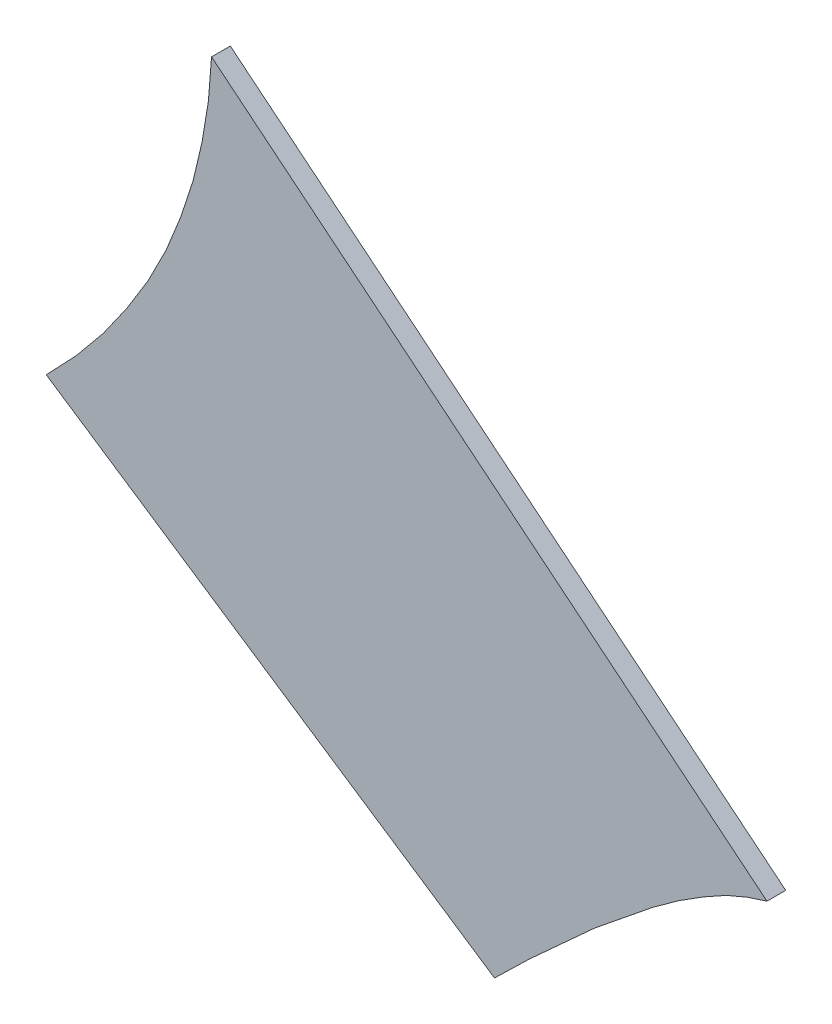
ISO-10303-21;
HEADER;
FILE_DESCRIPTION(('STEP AP214'),'2;1');
FILE_NAME('part.step','',(''),(''),'','','');
FILE_SCHEMA(('AUTOMOTIVE_DESIGN { 1 0 10303 214 1 1 1 1 }'));
ENDSEC;
DATA;
#1=APPLICATION_CONTEXT('core data for automotive mechanical design processes');
#2=APPLICATION_PROTOCOL_DEFINITION('international standard','automotive_design',2000,#1);
#3=PRODUCT_CONTEXT('',#1,'mechanical');
#4=PRODUCT('Part','Part','',(#3));
#5=PRODUCT_RELATED_PRODUCT_CATEGORY('part','',(#4));
#6=PRODUCT_DEFINITION_FORMATION('','',#4);
#7=PRODUCT_DEFINITION_CONTEXT('part definition',#1,'design');
#8=PRODUCT_DEFINITION('design','',#6,#7);
#9=PRODUCT_DEFINITION_SHAPE('','',#8);
#10=(LENGTH_UNIT() NAMED_UNIT(*) SI_UNIT(.MILLI.,.METRE.));
#11=(NAMED_UNIT(*) PLANE_ANGLE_UNIT() SI_UNIT($,.RADIAN.));
#12=(NAMED_UNIT(*) SI_UNIT($,.STERADIAN.) SOLID_ANGLE_UNIT());
#13=UNCERTAINTY_MEASURE_WITH_UNIT(LENGTH_MEASURE(1.E-05),#10,'distance_accuracy_value','');
#14=(GEOMETRIC_REPRESENTATION_CONTEXT(3) GLOBAL_UNCERTAINTY_ASSIGNED_CONTEXT((#13)) GLOBAL_UNIT_ASSIGNED_CONTEXT((#10,
#11,#12)) REPRESENTATION_CONTEXT('',''));
#15=CARTESIAN_POINT('',(0.,0.,0.));
#16=DIRECTION('',(0.,0.,1.));
#17=DIRECTION('',(1.,0.,0.));
#18=AXIS2_PLACEMENT_3D('',#15,#16,#17);
#19=CARTESIAN_POINT('',(57.1069984436035,61.390998840332,0.));
#20=DIRECTION('',(-0.696319404743988,0.717732043716162,0.));
#21=DIRECTION('',(0.717732043716162,0.696319404743988,0.));
#22=AXIS2_PLACEMENT_3D('',#19,#20,#21);
#23=PLANE('',#22);
#24=DIRECTION('',(0.717732043716162,0.696319404743988,0.));
#25=VECTOR('',#24,1.);
#26=CARTESIAN_POINT('',(57.1069984436035,61.390998840332,0.03556));
#27=LINE('',#26,#25);
#28=CARTESIAN_POINT('',(57.1069984436035,61.390998840332,0.03556));
#29=VERTEX_POINT('',#28);
#30=CARTESIAN_POINT('',(57.1739997863769,61.4560012817383,0.03556));
#31=VERTEX_POINT('',#30);
#32=EDGE_CURVE('E11',#29,#31,#27,.T.);
#33=ORIENTED_EDGE('',*,*,#32,.F.);
#34=DIRECTION('',(0.,0.,1.));
#35=VECTOR('',#34,1.);
#36=CARTESIAN_POINT('',(57.1069984436035,61.390998840332,0.));
#37=LINE('',#36,#35);
#38=CARTESIAN_POINT('',(57.1069984436035,61.390998840332,0.));
#39=VERTEX_POINT('',#38);
#40=EDGE_CURVE('E24',#39,#29,#37,.T.);
#41=ORIENTED_EDGE('',*,*,#40,.F.);
#42=DIRECTION('',(0.717732043716162,0.696319404743988,0.));
#43=VECTOR('',#42,1.);
#44=CARTESIAN_POINT('',(57.1069984436035,61.390998840332,0.));
#45=LINE('',#44,#43);
#46=CARTESIAN_POINT('',(57.1739997863769,61.4560012817383,0.));
#47=VERTEX_POINT('',#46);
#48=EDGE_CURVE('E172',#39,#47,#45,.T.);
#49=ORIENTED_EDGE('',*,*,#48,.T.);
#50=DIRECTION('',(0.,0.,1.));
#51=VECTOR('',#50,1.);
#52=CARTESIAN_POINT('',(57.1739997863769,61.4560012817383,0.));
#53=LINE('',#52,#51);
#54=EDGE_CURVE('E37',#47,#31,#53,.T.);
#55=ORIENTED_EDGE('',*,*,#54,.T.);
#56=EDGE_LOOP('',(#33,#41,#49,#55));
#57=FACE_BOUND('',#56,.T.);
#58=ADVANCED_FACE('F17',(#57),#23,.F.);
#59=CARTESIAN_POINT('',(57.1739997863769,61.4560012817383,0.));
#60=DIRECTION('',(-0.673266096357867,0.739400272852965,0.));
#61=DIRECTION('',(0.739400272852965,0.673266096357867,0.));
#62=AXIS2_PLACEMENT_3D('',#59,#60,#61);
#63=PLANE('',#62);
#64=DIRECTION('',(0.739400272852965,0.673266096357867,0.));
#65=VECTOR('',#64,1.);
#66=CARTESIAN_POINT('',(57.1739997863769,61.4560012817383,0.03556));
#67=LINE('',#66,#65);
#68=CARTESIAN_POINT('',(57.2970008850098,61.568000793457,0.03556));
#69=VERTEX_POINT('',#68);
#70=EDGE_CURVE('E308',#31,#69,#67,.T.);
#71=ORIENTED_EDGE('',*,*,#70,.F.);
#72=ORIENTED_EDGE('',*,*,#54,.F.);
#73=DIRECTION('',(0.739400272852965,0.673266096357867,0.));
#74=VECTOR('',#73,1.);
#75=CARTESIAN_POINT('',(57.1739997863769,61.4560012817383,0.));
#76=LINE('',#75,#74);
#77=CARTESIAN_POINT('',(57.2970008850098,61.568000793457,0.));
#78=VERTEX_POINT('',#77);
#79=EDGE_CURVE('E305',#47,#78,#76,.T.);
#80=ORIENTED_EDGE('',*,*,#79,.T.);
#81=DIRECTION('',(0.,0.,1.));
#82=VECTOR('',#81,1.);
#83=CARTESIAN_POINT('',(57.2970008850098,61.568000793457,0.));
#84=LINE('',#83,#82);
#85=EDGE_CURVE('E303',#78,#69,#84,.T.);
#86=ORIENTED_EDGE('',*,*,#85,.T.);
#87=EDGE_LOOP('',(#71,#72,#80,#86));
#88=FACE_BOUND('',#87,.T.);
#89=ADVANCED_FACE('F316',(#88),#63,.F.);
#90=CARTESIAN_POINT('',(57.2970008850098,61.568000793457,0.));
#91=DIRECTION('',(-0.628995788306774,0.777408707368486,0.));
#92=DIRECTION('',(0.777408707368486,0.628995788306774,0.));
#93=AXIS2_PLACEMENT_3D('',#90,#91,#92);
#94=PLANE('',#93);
#95=DIRECTION('',(0.777408707368486,0.628995788306774,0.));
#96=VECTOR('',#95,1.);
#97=CARTESIAN_POINT('',(57.2970008850098,61.568000793457,0.03556));
#98=LINE('',#97,#96);
#99=CARTESIAN_POINT('',(57.4070014953613,61.6570014953613,0.03556));
#100=VERTEX_POINT('',#99);
#101=EDGE_CURVE('E300',#69,#100,#98,.T.);
#102=ORIENTED_EDGE('',*,*,#101,.F.);
#103=ORIENTED_EDGE('',*,*,#85,.F.);
#104=DIRECTION('',(0.777408707368486,0.628995788306774,0.));
#105=VECTOR('',#104,1.);
#106=CARTESIAN_POINT('',(57.2970008850098,61.568000793457,0.));
#107=LINE('',#106,#105);
#108=CARTESIAN_POINT('',(57.4070014953613,61.6570014953613,0.));
#109=VERTEX_POINT('',#108);
#110=EDGE_CURVE('E297',#78,#109,#107,.T.);
#111=ORIENTED_EDGE('',*,*,#110,.T.);
#112=DIRECTION('',(0.,0.,1.));
#113=VECTOR('',#112,1.);
#114=CARTESIAN_POINT('',(57.4070014953613,61.6570014953613,0.));
#115=LINE('',#114,#113);
#116=EDGE_CURVE('E295',#109,#100,#115,.T.);
#117=ORIENTED_EDGE('',*,*,#116,.T.);
#118=EDGE_LOOP('',(#102,#103,#111,#117));
#119=FACE_BOUND('',#118,.T.);
#120=ADVANCED_FACE('F322',(#119),#94,.F.);
#121=CARTESIAN_POINT('',(57.4070014953613,61.6570014953613,0.));
#122=DIRECTION('',(-0.58430309475351,0.811535515834933,0.));
#123=DIRECTION('',(0.811535515834933,0.58430309475351,0.));
#124=AXIS2_PLACEMENT_3D('',#121,#122,#123);
#125=PLANE('',#124);
#126=DIRECTION('',(0.811535515834933,0.58430309475351,0.));
#127=VECTOR('',#126,1.);
#128=CARTESIAN_POINT('',(57.4070014953613,61.6570014953613,0.03556));
#129=LINE('',#128,#127);
#130=CARTESIAN_POINT('',(57.4570007324219,61.693000793457,0.03556));
#131=VERTEX_POINT('',#130);
#132=EDGE_CURVE('E292',#100,#131,#129,.T.);
#133=ORIENTED_EDGE('',*,*,#132,.F.);
#134=ORIENTED_EDGE('',*,*,#116,.F.);
#135=DIRECTION('',(0.811535515834933,0.58430309475351,0.));
#136=VECTOR('',#135,1.);
#137=CARTESIAN_POINT('',(57.4070014953613,61.6570014953613,0.));
#138=LINE('',#137,#136);
#139=CARTESIAN_POINT('',(57.4570007324219,61.693000793457,0.));
#140=VERTEX_POINT('',#139);
#141=EDGE_CURVE('E289',#109,#140,#138,.T.);
#142=ORIENTED_EDGE('',*,*,#141,.T.);
#143=DIRECTION('',(0.,0.,1.));
#144=VECTOR('',#143,1.);
#145=CARTESIAN_POINT('',(57.4570007324219,61.693000793457,0.));
#146=LINE('',#145,#144);
#147=EDGE_CURVE('E287',#140,#131,#146,.T.);
#148=ORIENTED_EDGE('',*,*,#147,.T.);
#149=EDGE_LOOP('',(#133,#134,#142,#148));
#150=FACE_BOUND('',#149,.T.);
#151=ADVANCED_FACE('F324',(#150),#125,.F.);
#152=CARTESIAN_POINT('',(57.4570007324219,61.693000793457,0.));
#153=DIRECTION('',(-0.533311836725897,0.845918722341603,0.));
#154=DIRECTION('',(0.845918722341603,0.533311836725897,0.));
#155=AXIS2_PLACEMENT_3D('',#152,#153,#154);
#156=PLANE('',#155);
#157=DIRECTION('',(0.845918722341603,0.533311836725897,0.));
#158=VECTOR('',#157,1.);
#159=CARTESIAN_POINT('',(57.4570007324219,61.693000793457,0.03556));
#160=LINE('',#159,#158);
#161=CARTESIAN_POINT('',(57.5029983520508,61.7220001220703,0.03556));
#162=VERTEX_POINT('',#161);
#163=EDGE_CURVE('E284',#131,#162,#160,.T.);
#164=ORIENTED_EDGE('',*,*,#163,.F.);
#165=ORIENTED_EDGE('',*,*,#147,.F.);
#166=DIRECTION('',(0.845918722341603,0.533311836725897,0.));
#167=VECTOR('',#166,1.);
#168=CARTESIAN_POINT('',(57.4570007324219,61.693000793457,0.));
#169=LINE('',#168,#167);
#170=CARTESIAN_POINT('',(57.5029983520508,61.7220001220703,0.));
#171=VERTEX_POINT('',#170);
#172=EDGE_CURVE('E281',#140,#171,#169,.T.);
#173=ORIENTED_EDGE('',*,*,#172,.T.);
#174=DIRECTION('',(0.,0.,1.));
#175=VECTOR('',#174,1.);
#176=CARTESIAN_POINT('',(57.5029983520508,61.7220001220703,0.));
#177=LINE('',#176,#175);
#178=EDGE_CURVE('E279',#171,#162,#177,.T.);
#179=ORIENTED_EDGE('',*,*,#178,.T.);
#180=EDGE_LOOP('',(#164,#165,#173,#179));
#181=FACE_BOUND('',#180,.T.);
#182=ADVANCED_FACE('F329',(#181),#156,.F.);
#183=CARTESIAN_POINT('',(57.5029983520508,61.7220001220703,0.));
#184=DIRECTION('',(-0.487312589874106,0.873227599054331,0.));
#185=DIRECTION('',(0.873227599054331,0.487312589874106,0.));
#186=AXIS2_PLACEMENT_3D('',#183,#184,#185);
#187=PLANE('',#186);
#188=DIRECTION('',(0.873227599054331,0.487312589874106,0.));
#189=VECTOR('',#188,1.);
#190=CARTESIAN_POINT('',(57.5029983520508,61.7220001220703,0.03556));
#191=LINE('',#190,#189);
#192=CARTESIAN_POINT('',(57.5460014343262,61.7459983825684,0.03556));
#193=VERTEX_POINT('',#192);
#194=EDGE_CURVE('E276',#162,#193,#191,.T.);
#195=ORIENTED_EDGE('',*,*,#194,.F.);
#196=ORIENTED_EDGE('',*,*,#178,.F.);
#197=DIRECTION('',(0.873227599054331,0.487312589874106,0.));
#198=VECTOR('',#197,1.);
#199=CARTESIAN_POINT('',(57.5029983520508,61.7220001220703,0.));
#200=LINE('',#199,#198);
#201=CARTESIAN_POINT('',(57.5460014343262,61.7459983825684,0.));
#202=VERTEX_POINT('',#201);
#203=EDGE_CURVE('E273',#171,#202,#200,.T.);
#204=ORIENTED_EDGE('',*,*,#203,.T.);
#205=DIRECTION('',(0.,0.,1.));
#206=VECTOR('',#205,1.);
#207=CARTESIAN_POINT('',(57.5460014343262,61.7459983825684,0.));
#208=LINE('',#207,#206);
#209=EDGE_CURVE('E271',#202,#193,#208,.T.);
#210=ORIENTED_EDGE('',*,*,#209,.T.);
#211=EDGE_LOOP('',(#195,#196,#204,#210));
#212=FACE_BOUND('',#211,.T.);
#213=ADVANCED_FACE('F332',(#212),#187,.F.);
#214=CARTESIAN_POINT('',(57.5460014343262,61.7459983825684,0.));
#215=DIRECTION('',(-0.391205691061362,0.920303269189674,0.));
#216=DIRECTION('',(0.920303269189674,0.391205691061362,0.));
#217=AXIS2_PLACEMENT_3D('',#214,#215,#216);
#218=PLANE('',#217);
#219=DIRECTION('',(0.920303269189674,0.391205691061362,0.));
#220=VECTOR('',#219,1.);
#221=CARTESIAN_POINT('',(57.5460014343262,61.7459983825684,0.03556));
#222=LINE('',#221,#220);
#223=CARTESIAN_POINT('',(57.5859985351562,61.7630004882812,0.03556));
#224=VERTEX_POINT('',#223);
#225=EDGE_CURVE('E268',#193,#224,#222,.T.);
#226=ORIENTED_EDGE('',*,*,#225,.F.);
#227=ORIENTED_EDGE('',*,*,#209,.F.);
#228=DIRECTION('',(0.920303269189674,0.391205691061362,0.));
#229=VECTOR('',#228,1.);
#230=CARTESIAN_POINT('',(57.5460014343262,61.7459983825684,0.));
#231=LINE('',#230,#229);
#232=CARTESIAN_POINT('',(57.5859985351562,61.7630004882812,0.));
#233=VERTEX_POINT('',#232);
#234=EDGE_CURVE('E265',#202,#233,#231,.T.);
#235=ORIENTED_EDGE('',*,*,#234,.T.);
#236=DIRECTION('',(0.,0.,1.));
#237=VECTOR('',#236,1.);
#238=CARTESIAN_POINT('',(57.5859985351562,61.7630004882812,0.));
#239=LINE('',#238,#237);
#240=EDGE_CURVE('E263',#233,#224,#239,.T.);
#241=ORIENTED_EDGE('',*,*,#240,.T.);
#242=EDGE_LOOP('',(#226,#227,#235,#241));
#243=FACE_BOUND('',#242,.T.);
#244=ADVANCED_FACE('F337',(#243),#218,.F.);
#245=CARTESIAN_POINT('',(57.5859985351562,61.7630004882812,0.));
#246=DIRECTION('',(-0.308509494292296,0.951221263393282,0.));
#247=DIRECTION('',(0.951221263393282,0.308509494292296,0.));
#248=AXIS2_PLACEMENT_3D('',#245,#246,#247);
#249=PLANE('',#248);
#250=DIRECTION('',(0.951221263393282,0.308509494292296,0.));
#251=VECTOR('',#250,1.);
#252=CARTESIAN_POINT('',(57.5859985351562,61.7630004882812,0.03556));
#253=LINE('',#252,#251);
#254=CARTESIAN_POINT('',(57.6230010986328,61.7750015258789,0.03556));
#255=VERTEX_POINT('',#254);
#256=EDGE_CURVE('E260',#224,#255,#253,.T.);
#257=ORIENTED_EDGE('',*,*,#256,.F.);
#258=ORIENTED_EDGE('',*,*,#240,.F.);
#259=DIRECTION('',(0.951221263393282,0.308509494292296,0.));
#260=VECTOR('',#259,1.);
#261=CARTESIAN_POINT('',(57.5859985351562,61.7630004882812,0.));
#262=LINE('',#261,#260);
#263=CARTESIAN_POINT('',(57.6230010986328,61.7750015258789,0.));
#264=VERTEX_POINT('',#263);
#265=EDGE_CURVE('E257',#233,#264,#262,.T.);
#266=ORIENTED_EDGE('',*,*,#265,.T.);
#267=DIRECTION('',(0.,0.,1.));
#268=VECTOR('',#267,1.);
#269=CARTESIAN_POINT('',(57.6230010986328,61.7750015258789,0.));
#270=LINE('',#269,#268);
#271=EDGE_CURVE('E255',#264,#255,#270,.T.);
#272=ORIENTED_EDGE('',*,*,#271,.T.);
#273=EDGE_LOOP('',(#257,#258,#266,#272));
#274=FACE_BOUND('',#273,.T.);
#275=ADVANCED_FACE('F340',(#274),#249,.F.);
#276=CARTESIAN_POINT('',(57.6230010986328,61.7750015258789,0.));
#277=DIRECTION('',(-0.63247379801447,-0.774581754771665,0.));
#278=DIRECTION('',(-0.774581754771665,0.63247379801447,0.));
#279=AXIS2_PLACEMENT_3D('',#276,#277,#278);
#280=PLANE('',#279);
#281=DIRECTION('',(-0.774581754771665,0.63247379801447,0.));
#282=VECTOR('',#281,1.);
#283=CARTESIAN_POINT('',(57.6230010986328,61.7750015258789,0.03556));
#284=LINE('',#283,#282);
#285=CARTESIAN_POINT('',(56.5709991455078,62.6339988708496,0.03556));
#286=VERTEX_POINT('',#285);
#287=EDGE_CURVE('E252',#255,#286,#284,.T.);
#288=ORIENTED_EDGE('',*,*,#287,.F.);
#289=ORIENTED_EDGE('',*,*,#271,.F.);
#290=DIRECTION('',(-0.774581754771665,0.63247379801447,0.));
#291=VECTOR('',#290,1.);
#292=CARTESIAN_POINT('',(57.6230010986328,61.7750015258789,0.));
#293=LINE('',#292,#291);
#294=CARTESIAN_POINT('',(56.5709991455078,62.6339988708496,0.));
#295=VERTEX_POINT('',#294);
#296=EDGE_CURVE('E249',#264,#295,#293,.T.);
#297=ORIENTED_EDGE('',*,*,#296,.T.);
#298=DIRECTION('',(0.,0.,1.));
#299=VECTOR('',#298,1.);
#300=CARTESIAN_POINT('',(56.5709991455078,62.6339988708496,0.));
#301=LINE('',#300,#299);
#302=EDGE_CURVE('E247',#295,#286,#301,.T.);
#303=ORIENTED_EDGE('',*,*,#302,.T.);
#304=EDGE_LOOP('',(#288,#289,#297,#303));
#305=FACE_BOUND('',#304,.T.);
#306=ADVANCED_FACE('F345',(#305),#280,.F.);
#307=CARTESIAN_POINT('',(56.5709991455078,62.6339988708496,0.));
#308=DIRECTION('',(0.996897632071162,-0.0787090285222074,0.));
#309=DIRECTION('',(-0.0787090285222074,-0.996897632071162,0.));
#310=AXIS2_PLACEMENT_3D('',#307,#308,#309);
#311=PLANE('',#310);
#312=DIRECTION('',(-0.0787090285222074,-0.996897632071162,0.));
#313=VECTOR('',#312,1.);
#314=CARTESIAN_POINT('',(56.5709991455078,62.6339988708496,0.03556));
#315=LINE('',#314,#313);
#316=CARTESIAN_POINT('',(56.564998626709,62.5579986572266,0.03556));
#317=VERTEX_POINT('',#316);
#318=EDGE_CURVE('E244',#286,#317,#315,.T.);
#319=ORIENTED_EDGE('',*,*,#318,.F.);
#320=ORIENTED_EDGE('',*,*,#302,.F.);
#321=DIRECTION('',(-0.0787090285222074,-0.996897632071162,0.));
#322=VECTOR('',#321,1.);
#323=CARTESIAN_POINT('',(56.5709991455078,62.6339988708496,0.));
#324=LINE('',#323,#322);
#325=CARTESIAN_POINT('',(56.564998626709,62.5579986572266,0.));
#326=VERTEX_POINT('',#325);
#327=EDGE_CURVE('E241',#295,#326,#324,.T.);
#328=ORIENTED_EDGE('',*,*,#327,.T.);
#329=DIRECTION('',(0.,0.,1.));
#330=VECTOR('',#329,1.);
#331=CARTESIAN_POINT('',(56.564998626709,62.5579986572266,0.));
#332=LINE('',#331,#330);
#333=EDGE_CURVE('E239',#326,#317,#332,.T.);
#334=ORIENTED_EDGE('',*,*,#333,.T.);
#335=EDGE_LOOP('',(#319,#320,#328,#334));
#336=FACE_BOUND('',#335,.T.);
#337=ADVANCED_FACE('F348',(#336),#311,.F.);
#338=CARTESIAN_POINT('',(56.564998626709,62.5579986572266,0.));
#339=DIRECTION('',(0.986762131871419,-0.162174273867873,0.));
#340=DIRECTION('',(-0.162174273867873,-0.986762131871419,0.));
#341=AXIS2_PLACEMENT_3D('',#338,#339,#340);
#342=PLANE('',#341);
#343=DIRECTION('',(-0.162174273867873,-0.986762131871419,0.));
#344=VECTOR('',#343,1.);
#345=CARTESIAN_POINT('',(56.564998626709,62.5579986572266,0.03556));
#346=LINE('',#345,#344);
#347=CARTESIAN_POINT('',(56.5530014038086,62.4850006103516,0.03556));
#348=VERTEX_POINT('',#347);
#349=EDGE_CURVE('E236',#317,#348,#346,.T.);
#350=ORIENTED_EDGE('',*,*,#349,.F.);
#351=ORIENTED_EDGE('',*,*,#333,.F.);
#352=DIRECTION('',(-0.162174273867873,-0.986762131871419,0.));
#353=VECTOR('',#352,1.);
#354=CARTESIAN_POINT('',(56.564998626709,62.5579986572266,0.));
#355=LINE('',#354,#353);
#356=CARTESIAN_POINT('',(56.5530014038086,62.4850006103516,0.));
#357=VERTEX_POINT('',#356);
#358=EDGE_CURVE('E233',#326,#357,#355,.T.);
#359=ORIENTED_EDGE('',*,*,#358,.T.);
#360=DIRECTION('',(0.,0.,1.));
#361=VECTOR('',#360,1.);
#362=CARTESIAN_POINT('',(56.5530014038086,62.4850006103516,0.));
#363=LINE('',#362,#361);
#364=EDGE_CURVE('E231',#357,#348,#363,.T.);
#365=ORIENTED_EDGE('',*,*,#364,.T.);
#366=EDGE_LOOP('',(#350,#351,#359,#365));
#367=FACE_BOUND('',#366,.T.);
#368=ADVANCED_FACE('F353',(#367),#342,.F.);
#369=CARTESIAN_POINT('',(56.5530014038086,62.4850006103516,0.));
#370=DIRECTION('',(0.973234956949504,-0.229812355132394,0.));
#371=DIRECTION('',(-0.229812355132394,-0.973234956949504,0.));
#372=AXIS2_PLACEMENT_3D('',#369,#370,#371);
#373=PLANE('',#372);
#374=DIRECTION('',(-0.229812355132394,-0.973234956949504,0.));
#375=VECTOR('',#374,1.);
#376=CARTESIAN_POINT('',(56.5530014038086,62.4850006103516,0.03556));
#377=LINE('',#376,#375);
#378=CARTESIAN_POINT('',(56.5359992980957,62.4129981994629,0.03556));
#379=VERTEX_POINT('',#378);
#380=EDGE_CURVE('E228',#348,#379,#377,.T.);
#381=ORIENTED_EDGE('',*,*,#380,.F.);
#382=ORIENTED_EDGE('',*,*,#364,.F.);
#383=DIRECTION('',(-0.229812355132394,-0.973234956949504,0.));
#384=VECTOR('',#383,1.);
#385=CARTESIAN_POINT('',(56.5530014038086,62.4850006103516,0.));
#386=LINE('',#385,#384);
#387=CARTESIAN_POINT('',(56.5359992980957,62.4129981994629,0.));
#388=VERTEX_POINT('',#387);
#389=EDGE_CURVE('E225',#357,#388,#386,.T.);
#390=ORIENTED_EDGE('',*,*,#389,.T.);
#391=DIRECTION('',(0.,0.,1.));
#392=VECTOR('',#391,1.);
#393=CARTESIAN_POINT('',(56.5359992980957,62.4129981994629,0.));
#394=LINE('',#393,#392);
#395=EDGE_CURVE('E223',#388,#379,#394,.T.);
#396=ORIENTED_EDGE('',*,*,#395,.T.);
#397=EDGE_LOOP('',(#381,#382,#390,#396));
#398=FACE_BOUND('',#397,.T.);
#399=ADVANCED_FACE('F356',(#398),#373,.F.);
#400=CARTESIAN_POINT('',(56.5359992980957,62.4129981994629,0.));
#401=DIRECTION('',(0.950036135688206,-0.312139937987149,0.));
#402=DIRECTION('',(-0.312139937987149,-0.950036135688206,0.));
#403=AXIS2_PLACEMENT_3D('',#400,#401,#402);
#404=PLANE('',#403);
#405=DIRECTION('',(-0.312139937987149,-0.950036135688206,0.));
#406=VECTOR('',#405,1.);
#407=CARTESIAN_POINT('',(56.5359992980957,62.4129981994629,0.03556));
#408=LINE('',#407,#406);
#409=CARTESIAN_POINT('',(56.5130004882812,62.3429985046387,0.03556));
#410=VERTEX_POINT('',#409);
#411=EDGE_CURVE('E220',#379,#410,#408,.T.);
#412=ORIENTED_EDGE('',*,*,#411,.F.);
#413=ORIENTED_EDGE('',*,*,#395,.F.);
#414=DIRECTION('',(-0.312139937987149,-0.950036135688206,0.));
#415=VECTOR('',#414,1.);
#416=CARTESIAN_POINT('',(56.5359992980957,62.4129981994629,0.));
#417=LINE('',#416,#415);
#418=CARTESIAN_POINT('',(56.5130004882812,62.3429985046387,0.));
#419=VERTEX_POINT('',#418);
#420=EDGE_CURVE('E217',#388,#419,#417,.T.);
#421=ORIENTED_EDGE('',*,*,#420,.T.);
#422=DIRECTION('',(0.,0.,1.));
#423=VECTOR('',#422,1.);
#424=CARTESIAN_POINT('',(56.5130004882812,62.3429985046387,0.));
#425=LINE('',#424,#423);
#426=EDGE_CURVE('E215',#419,#410,#425,.T.);
#427=ORIENTED_EDGE('',*,*,#426,.T.);
#428=EDGE_LOOP('',(#412,#413,#421,#427));
#429=FACE_BOUND('',#428,.T.);
#430=ADVANCED_FACE('F361',(#429),#404,.F.);
#431=CARTESIAN_POINT('',(56.5130004882812,62.3429985046387,0.));
#432=DIRECTION('',(0.926613878138875,-0.376014256166483,0.));
#433=DIRECTION('',(-0.376014256166483,-0.926613878138875,0.));
#434=AXIS2_PLACEMENT_3D('',#431,#432,#433);
#435=PLANE('',#434);
#436=DIRECTION('',(-0.376014256166483,-0.926613878138875,0.));
#437=VECTOR('',#436,1.);
#438=CARTESIAN_POINT('',(56.5130004882812,62.3429985046387,0.03556));
#439=LINE('',#438,#437);
#440=CARTESIAN_POINT('',(56.4850006103516,62.273998260498,0.03556));
#441=VERTEX_POINT('',#440);
#442=EDGE_CURVE('E212',#410,#441,#439,.T.);
#443=ORIENTED_EDGE('',*,*,#442,.F.);
#444=ORIENTED_EDGE('',*,*,#426,.F.);
#445=DIRECTION('',(-0.376014256166483,-0.926613878138875,0.));
#446=VECTOR('',#445,1.);
#447=CARTESIAN_POINT('',(56.5130004882812,62.3429985046387,0.));
#448=LINE('',#447,#446);
#449=CARTESIAN_POINT('',(56.4850006103516,62.273998260498,0.));
#450=VERTEX_POINT('',#449);
#451=EDGE_CURVE('E209',#419,#450,#448,.T.);
#452=ORIENTED_EDGE('',*,*,#451,.T.);
#453=DIRECTION('',(0.,0.,1.));
#454=VECTOR('',#453,1.);
#455=CARTESIAN_POINT('',(56.4850006103516,62.273998260498,0.));
#456=LINE('',#455,#454);
#457=EDGE_CURVE('E207',#450,#441,#456,.T.);
#458=ORIENTED_EDGE('',*,*,#457,.T.);
#459=EDGE_LOOP('',(#443,#444,#452,#458));
#460=FACE_BOUND('',#459,.T.);
#461=ADVANCED_FACE('F364',(#460),#435,.F.);
#462=CARTESIAN_POINT('',(56.4850006103516,62.2739982604981,0.));
#463=DIRECTION('',(0.891740539013006,-0.452547026374932,0.));
#464=DIRECTION('',(-0.452547026374932,-0.891740539013006,0.));
#465=AXIS2_PLACEMENT_3D('',#462,#463,#464);
#466=PLANE('',#465);
#467=DIRECTION('',(-0.452547026374932,-0.891740539013006,0.));
#468=VECTOR('',#467,1.);
#469=CARTESIAN_POINT('',(56.4850006103516,62.273998260498,0.03556));
#470=LINE('',#469,#468);
#471=CARTESIAN_POINT('',(56.451000213623,62.2070007324219,0.03556));
#472=VERTEX_POINT('',#471);
#473=EDGE_CURVE('E204',#441,#472,#470,.T.);
#474=ORIENTED_EDGE('',*,*,#473,.F.);
#475=ORIENTED_EDGE('',*,*,#457,.F.);
#476=DIRECTION('',(-0.452547026374932,-0.891740539013006,0.));
#477=VECTOR('',#476,1.);
#478=CARTESIAN_POINT('',(56.4850006103516,62.273998260498,0.));
#479=LINE('',#478,#477);
#480=CARTESIAN_POINT('',(56.451000213623,62.2070007324219,0.));
#481=VERTEX_POINT('',#480);
#482=EDGE_CURVE('E201',#450,#481,#479,.T.);
#483=ORIENTED_EDGE('',*,*,#482,.T.);
#484=DIRECTION('',(0.,0.,1.));
#485=VECTOR('',#484,1.);
#486=CARTESIAN_POINT('',(56.451000213623,62.2070007324219,0.));
#487=LINE('',#486,#485);
#488=EDGE_CURVE('E199',#481,#472,#487,.T.);
#489=ORIENTED_EDGE('',*,*,#488,.T.);
#490=EDGE_LOOP('',(#474,#475,#483,#489));
#491=FACE_BOUND('',#490,.T.);
#492=ADVANCED_FACE('F369',(#491),#466,.F.);
#493=CARTESIAN_POINT('',(56.451000213623,62.2070007324219,0.));
#494=DIRECTION('',(0.851661748799558,-0.524091848469024,0.));
#495=DIRECTION('',(-0.524091848469024,-0.851661748799558,0.));
#496=AXIS2_PLACEMENT_3D('',#493,#494,#495);
#497=PLANE('',#496);
#498=DIRECTION('',(-0.524091848469024,-0.851661748799558,0.));
#499=VECTOR('',#498,1.);
#500=CARTESIAN_POINT('',(56.451000213623,62.2070007324219,0.03556));
#501=LINE('',#500,#499);
#502=CARTESIAN_POINT('',(56.4109992980957,62.1419982910156,0.03556));
#503=VERTEX_POINT('',#502);
#504=EDGE_CURVE('E196',#472,#503,#501,.T.);
#505=ORIENTED_EDGE('',*,*,#504,.F.);
#506=ORIENTED_EDGE('',*,*,#488,.F.);
#507=DIRECTION('',(-0.524091848469024,-0.851661748799558,0.));
#508=VECTOR('',#507,1.);
#509=CARTESIAN_POINT('',(56.451000213623,62.2070007324219,0.));
#510=LINE('',#509,#508);
#511=CARTESIAN_POINT('',(56.4109992980957,62.1419982910156,0.));
#512=VERTEX_POINT('',#511);
#513=EDGE_CURVE('E193',#481,#512,#510,.T.);
#514=ORIENTED_EDGE('',*,*,#513,.T.);
#515=DIRECTION('',(0.,0.,1.));
#516=VECTOR('',#515,1.);
#517=CARTESIAN_POINT('',(56.4109992980957,62.1419982910156,0.));
#518=LINE('',#517,#516);
#519=EDGE_CURVE('E191',#512,#503,#518,.T.);
#520=ORIENTED_EDGE('',*,*,#519,.T.);
#521=EDGE_LOOP('',(#505,#506,#514,#520));
#522=FACE_BOUND('',#521,.T.);
#523=ADVANCED_FACE('F372',(#522),#497,.F.);
#524=CARTESIAN_POINT('',(56.4109992980957,62.1419982910156,0.));
#525=DIRECTION('',(0.818036686113188,-0.575166045740666,0.));
#526=DIRECTION('',(-0.575166045740666,-0.818036686113188,0.));
#527=AXIS2_PLACEMENT_3D('',#524,#525,#526);
#528=PLANE('',#527);
#529=DIRECTION('',(-0.575166045740666,-0.818036686113187,0.));
#530=VECTOR('',#529,1.);
#531=CARTESIAN_POINT('',(56.4109992980957,62.1419982910156,0.03556));
#532=LINE('',#531,#530);
#533=CARTESIAN_POINT('',(56.3660011291504,62.0779991149902,0.03556));
#534=VERTEX_POINT('',#533);
#535=EDGE_CURVE('E188',#503,#534,#532,.T.);
#536=ORIENTED_EDGE('',*,*,#535,.F.);
#537=ORIENTED_EDGE('',*,*,#519,.F.);
#538=DIRECTION('',(-0.575166045740666,-0.818036686113187,0.));
#539=VECTOR('',#538,1.);
#540=CARTESIAN_POINT('',(56.4109992980957,62.1419982910156,0.));
#541=LINE('',#540,#539);
#542=CARTESIAN_POINT('',(56.3660011291504,62.0779991149902,0.));
#543=VERTEX_POINT('',#542);
#544=EDGE_CURVE('E185',#512,#543,#541,.T.);
#545=ORIENTED_EDGE('',*,*,#544,.T.);
#546=DIRECTION('',(0.,0.,1.));
#547=VECTOR('',#546,1.);
#548=CARTESIAN_POINT('',(56.3660011291504,62.0779991149902,0.));
#549=LINE('',#548,#547);
#550=EDGE_CURVE('E183',#543,#534,#549,.T.);
#551=ORIENTED_EDGE('',*,*,#550,.T.);
#552=EDGE_LOOP('',(#536,#537,#545,#551));
#553=FACE_BOUND('',#552,.T.);
#554=ADVANCED_FACE('F377',(#553),#528,.F.);
#555=CARTESIAN_POINT('',(56.3660011291504,62.0779991149902,0.));
#556=DIRECTION('',(0.772275762879046,-0.635287451528508,0.));
#557=DIRECTION('',(-0.635287451528508,-0.772275762879046,0.));
#558=AXIS2_PLACEMENT_3D('',#555,#556,#557);
#559=PLANE('',#558);
#560=DIRECTION('',(-0.635287451528508,-0.772275762879046,0.));
#561=VECTOR('',#560,1.);
#562=CARTESIAN_POINT('',(56.3660011291504,62.0779991149902,0.03556));
#563=LINE('',#562,#561);
#564=CARTESIAN_POINT('',(56.314998626709,62.015998840332,0.03556));
#565=VERTEX_POINT('',#564);
#566=EDGE_CURVE('E180',#534,#565,#563,.T.);
#567=ORIENTED_EDGE('',*,*,#566,.F.);
#568=ORIENTED_EDGE('',*,*,#550,.F.);
#569=DIRECTION('',(-0.635287451528508,-0.772275762879046,0.));
#570=VECTOR('',#569,1.);
#571=CARTESIAN_POINT('',(56.3660011291504,62.0779991149902,0.));
#572=LINE('',#571,#570);
#573=CARTESIAN_POINT('',(56.314998626709,62.015998840332,0.));
#574=VERTEX_POINT('',#573);
#575=EDGE_CURVE('E178',#543,#574,#572,.T.);
#576=ORIENTED_EDGE('',*,*,#575,.T.);
#577=DIRECTION('',(0.,0.,1.));
#578=VECTOR('',#577,1.);
#579=CARTESIAN_POINT('',(56.314998626709,62.015998840332,0.));
#580=LINE('',#579,#578);
#581=EDGE_CURVE('E163',#574,#565,#580,.T.);
#582=ORIENTED_EDGE('',*,*,#581,.T.);
#583=EDGE_LOOP('',(#567,#568,#576,#582));
#584=FACE_BOUND('',#583,.T.);
#585=ADVANCED_FACE('F379',(#584),#559,.F.);
#586=CARTESIAN_POINT('',(56.314998626709,62.015998840332,0.));
#587=DIRECTION('',(0.724990226541519,-0.688759153419594,0.));
#588=DIRECTION('',(-0.688759153419594,-0.724990226541519,0.));
#589=AXIS2_PLACEMENT_3D('',#586,#587,#588);
#590=PLANE('',#589);
#591=DIRECTION('',(-0.688759153419594,-0.724990226541519,0.));
#592=VECTOR('',#591,1.);
#593=CARTESIAN_POINT('',(56.314998626709,62.015998840332,0.03556));
#594=LINE('',#593,#592);
#595=CARTESIAN_POINT('',(56.257999420166,61.9560012817383,0.03556));
#596=VERTEX_POINT('',#595);
#597=EDGE_CURVE('E167',#565,#596,#594,.T.);
#598=ORIENTED_EDGE('',*,*,#597,.F.);
#599=ORIENTED_EDGE('',*,*,#581,.F.);
#600=DIRECTION('',(-0.688759153419594,-0.724990226541519,0.));
#601=VECTOR('',#600,1.);
#602=CARTESIAN_POINT('',(56.314998626709,62.015998840332,0.));
#603=LINE('',#602,#601);
#604=CARTESIAN_POINT('',(56.257999420166,61.9560012817383,0.));
#605=VERTEX_POINT('',#604);
#606=EDGE_CURVE('E159',#574,#605,#603,.T.);
#607=ORIENTED_EDGE('',*,*,#606,.T.);
#608=DIRECTION('',(0.,0.,1.));
#609=VECTOR('',#608,1.);
#610=CARTESIAN_POINT('',(56.257999420166,61.9560012817383,0.));
#611=LINE('',#610,#609);
#612=EDGE_CURVE('E149',#605,#596,#611,.T.);
#613=ORIENTED_EDGE('',*,*,#612,.T.);
#614=EDGE_LOOP('',(#598,#599,#607,#613));
#615=FACE_BOUND('',#614,.T.);
#616=ADVANCED_FACE('F162',(#615),#590,.F.);
#617=CARTESIAN_POINT('',(56.257999420166,61.9560012817383,0.));
#618=DIRECTION('',(0.554023257366488,0.832501189366734,0.));
#619=DIRECTION('',(0.832501189366734,-0.554023257366488,0.));
#620=AXIS2_PLACEMENT_3D('',#617,#618,#619);
#621=PLANE('',#620);
#622=DIRECTION('',(0.832501189366734,-0.554023257366488,0.));
#623=VECTOR('',#622,1.);
#624=CARTESIAN_POINT('',(56.257999420166,61.9560012817383,0.03556));
#625=LINE('',#624,#623);
#626=EDGE_CURVE('E155',#596,#29,#625,.T.);
#627=ORIENTED_EDGE('',*,*,#626,.F.);
#628=ORIENTED_EDGE('',*,*,#612,.F.);
#629=DIRECTION('',(0.832501189366734,-0.554023257366488,0.));
#630=VECTOR('',#629,1.);
#631=CARTESIAN_POINT('',(56.257999420166,61.9560012817383,0.));
#632=LINE('',#631,#630);
#633=EDGE_CURVE('E153',#605,#39,#632,.T.);
#634=ORIENTED_EDGE('',*,*,#633,.T.);
#635=ORIENTED_EDGE('',*,*,#40,.T.);
#636=EDGE_LOOP('',(#627,#628,#634,#635));
#637=FACE_BOUND('',#636,.T.);
#638=ADVANCED_FACE('F151',(#637),#621,.F.);
#639=CARTESIAN_POINT('',(57.1069984436035,61.390998840332,0.));
#640=DIRECTION('',(0.,0.,1.));
#641=DIRECTION('',(1.,0.,0.));
#642=AXIS2_PLACEMENT_3D('',#639,#640,#641);
#643=PLANE('',#642);
#644=ORIENTED_EDGE('',*,*,#633,.F.);
#645=ORIENTED_EDGE('',*,*,#606,.F.);
#646=ORIENTED_EDGE('',*,*,#575,.F.);
#647=ORIENTED_EDGE('',*,*,#544,.F.);
#648=ORIENTED_EDGE('',*,*,#513,.F.);
#649=ORIENTED_EDGE('',*,*,#482,.F.);
#650=ORIENTED_EDGE('',*,*,#451,.F.);
#651=ORIENTED_EDGE('',*,*,#420,.F.);
#652=ORIENTED_EDGE('',*,*,#389,.F.);
#653=ORIENTED_EDGE('',*,*,#358,.F.);
#654=ORIENTED_EDGE('',*,*,#327,.F.);
#655=ORIENTED_EDGE('',*,*,#296,.F.);
#656=ORIENTED_EDGE('',*,*,#265,.F.);
#657=ORIENTED_EDGE('',*,*,#234,.F.);
#658=ORIENTED_EDGE('',*,*,#203,.F.);
#659=ORIENTED_EDGE('',*,*,#172,.F.);
#660=ORIENTED_EDGE('',*,*,#141,.F.);
#661=ORIENTED_EDGE('',*,*,#110,.F.);
#662=ORIENTED_EDGE('',*,*,#79,.F.);
#663=ORIENTED_EDGE('',*,*,#48,.F.);
#664=EDGE_LOOP('',(#644,#645,#646,#647,#648,#649,#650,#651,#652,#653,#654,#655,#656,#657,#658,
#659,#660,#661,#662,#663));
#665=FACE_BOUND('',#664,.T.);
#666=ADVANCED_FACE('F170',(#665),#643,.F.);
#667=CARTESIAN_POINT('',(57.1069984436035,61.390998840332,0.03556));
#668=DIRECTION('',(0.,0.,1.));
#669=DIRECTION('',(1.,0.,0.));
#670=AXIS2_PLACEMENT_3D('',#667,#668,#669);
#671=PLANE('',#670);
#672=ORIENTED_EDGE('',*,*,#32,.T.);
#673=ORIENTED_EDGE('',*,*,#70,.T.);
#674=ORIENTED_EDGE('',*,*,#101,.T.);
#675=ORIENTED_EDGE('',*,*,#132,.T.);
#676=ORIENTED_EDGE('',*,*,#163,.T.);
#677=ORIENTED_EDGE('',*,*,#194,.T.);
#678=ORIENTED_EDGE('',*,*,#225,.T.);
#679=ORIENTED_EDGE('',*,*,#256,.T.);
#680=ORIENTED_EDGE('',*,*,#287,.T.);
#681=ORIENTED_EDGE('',*,*,#318,.T.);
#682=ORIENTED_EDGE('',*,*,#349,.T.);
#683=ORIENTED_EDGE('',*,*,#380,.T.);
#684=ORIENTED_EDGE('',*,*,#411,.T.);
#685=ORIENTED_EDGE('',*,*,#442,.T.);
#686=ORIENTED_EDGE('',*,*,#473,.T.);
#687=ORIENTED_EDGE('',*,*,#504,.T.);
#688=ORIENTED_EDGE('',*,*,#535,.T.);
#689=ORIENTED_EDGE('',*,*,#566,.T.);
#690=ORIENTED_EDGE('',*,*,#597,.T.);
#691=ORIENTED_EDGE('',*,*,#626,.T.);
#692=EDGE_LOOP('',(#672,#673,#674,#675,#676,#677,#678,#679,#680,#681,#682,#683,#684,#685,#686,
#687,#688,#689,#690,#691));
#693=FACE_BOUND('',#692,.T.);
#694=ADVANCED_FACE('F319',(#693),#671,.T.);
#695=CLOSED_SHELL('',(#58,#89,#120,#151,#182,#213,#244,#275,#306,#337,#368,#399,#430,#461,#492,
#523,#554,#585,#616,#638,#666,#694));
#696=MANIFOLD_SOLID_BREP('B1',#695);
#697=ADVANCED_BREP_SHAPE_REPRESENTATION('',(#18,#696),#14);
#698=SHAPE_DEFINITION_REPRESENTATION(#9,#697);
ENDSEC;
END-ISO-10303-21;
